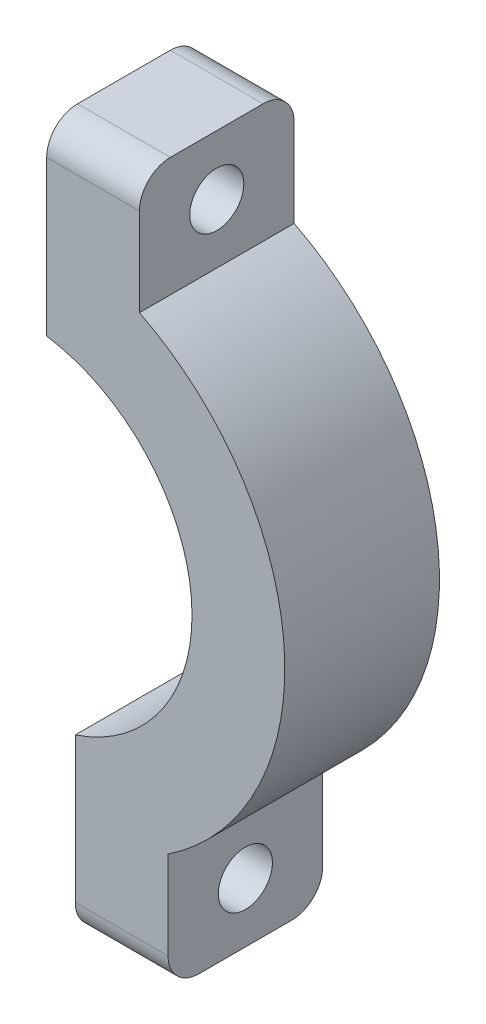
ISO-10303-21;
HEADER;
FILE_DESCRIPTION(('STEP AP214'),'2;1');
FILE_NAME('part.step','',(''),(''),'','','');
FILE_SCHEMA(('AUTOMOTIVE_DESIGN { 1 0 10303 214 1 1 1 1 }'));
ENDSEC;
DATA;
#1=APPLICATION_CONTEXT('core data for automotive mechanical design processes');
#2=APPLICATION_PROTOCOL_DEFINITION('international standard','automotive_design',2000,#1);
#3=PRODUCT_CONTEXT('',#1,'mechanical');
#4=PRODUCT('Part','Part','',(#3));
#5=PRODUCT_RELATED_PRODUCT_CATEGORY('part','',(#4));
#6=PRODUCT_DEFINITION_FORMATION('','',#4);
#7=PRODUCT_DEFINITION_CONTEXT('part definition',#1,'design');
#8=PRODUCT_DEFINITION('design','',#6,#7);
#9=PRODUCT_DEFINITION_SHAPE('','',#8);
#10=(LENGTH_UNIT() NAMED_UNIT(*) SI_UNIT(.MILLI.,.METRE.));
#11=(NAMED_UNIT(*) PLANE_ANGLE_UNIT() SI_UNIT($,.RADIAN.));
#12=(NAMED_UNIT(*) SI_UNIT($,.STERADIAN.) SOLID_ANGLE_UNIT());
#13=UNCERTAINTY_MEASURE_WITH_UNIT(LENGTH_MEASURE(1.E-05),#10,'distance_accuracy_value','');
#14=(GEOMETRIC_REPRESENTATION_CONTEXT(3) GLOBAL_UNCERTAINTY_ASSIGNED_CONTEXT((#13)) GLOBAL_UNIT_ASSIGNED_CONTEXT((#10,
#11,#12)) REPRESENTATION_CONTEXT('',''));
#15=CARTESIAN_POINT('',(0.,0.,0.));
#16=DIRECTION('',(0.,0.,1.));
#17=DIRECTION('',(1.,0.,0.));
#18=AXIS2_PLACEMENT_3D('',#15,#16,#17);
#19=CARTESIAN_POINT('',(9.5,-21.8581248758443,10.));
#20=DIRECTION('',(0.,-1.,0.));
#21=DIRECTION('',(0.,0.,-1.));
#22=AXIS2_PLACEMENT_3D('',#19,#20,#21);
#23=PLANE('',#22);
#24=DIRECTION('',(0.,0.,-1.));
#25=VECTOR('',#24,1.);
#26=CARTESIAN_POINT('',(9.5,-21.8581248758443,10.));
#27=LINE('',#26,#25);
#28=CARTESIAN_POINT('',(9.5,-21.8581248758443,8.));
#29=VERTEX_POINT('',#28);
#30=CARTESIAN_POINT('',(9.5,-21.8581248758443,2.));
#31=VERTEX_POINT('',#30);
#32=EDGE_CURVE('E132',#29,#31,#27,.T.);
#33=ORIENTED_EDGE('',*,*,#32,.F.);
#34=DIRECTION('',(-1.,0.,0.));
#35=VECTOR('',#34,1.);
#36=CARTESIAN_POINT('',(9.5,-21.8581248758443,8.));
#37=LINE('',#36,#35);
#38=CARTESIAN_POINT('',(3.5,-21.8581248758443,8.));
#39=VERTEX_POINT('',#38);
#40=EDGE_CURVE('E198',#29,#39,#37,.T.);
#41=ORIENTED_EDGE('',*,*,#40,.T.);
#42=DIRECTION('',(0.,0.,-1.));
#43=VECTOR('',#42,1.);
#44=CARTESIAN_POINT('',(3.5,-21.8581248758443,10.));
#45=LINE('',#44,#43);
#46=CARTESIAN_POINT('',(3.5,-21.8581248758443,2.));
#47=VERTEX_POINT('',#46);
#48=EDGE_CURVE('E186',#39,#47,#45,.T.);
#49=ORIENTED_EDGE('',*,*,#48,.T.);
#50=DIRECTION('',(-1.,0.,0.));
#51=VECTOR('',#50,1.);
#52=CARTESIAN_POINT('',(9.5,-21.8581248758443,2.));
#53=LINE('',#52,#51);
#54=EDGE_CURVE('E189',#47,#31,#53,.F.);
#55=ORIENTED_EDGE('',*,*,#54,.T.);
#56=EDGE_LOOP('',(#33,#41,#49,#55));
#57=FACE_BOUND('',#56,.T.);
#58=ADVANCED_FACE('F33',(#57),#23,.T.);
#59=CARTESIAN_POINT('',(9.5,-14.1581248758443,10.));
#60=DIRECTION('',(1.,0.,0.));
#61=DIRECTION('',(0.,1.,0.));
#62=AXIS2_PLACEMENT_3D('',#59,#60,#61);
#63=PLANE('',#62);
#64=CARTESIAN_POINT('',(9.5,-18.0081248758443,5.));
#65=DIRECTION('',(1.,0.,0.));
#66=DIRECTION('',(0.,1.,0.));
#67=AXIS2_PLACEMENT_3D('',#64,#65,#66);
#68=CIRCLE('',#67,1.75);
#69=CARTESIAN_POINT('',(9.5,-16.2581248758443,5.));
#70=VERTEX_POINT('',#69);
#71=EDGE_CURVE('E192',#70,#70,#68,.T.);
#72=ORIENTED_EDGE('',*,*,#71,.F.);
#73=EDGE_LOOP('',(#72));
#74=FACE_BOUND('',#73,.T.);
#75=DIRECTION('',(0.,-1.,0.));
#76=VECTOR('',#75,1.);
#77=CARTESIAN_POINT('',(9.5,-14.1581248758443,10.));
#78=LINE('',#77,#76);
#79=CARTESIAN_POINT('',(9.5,-14.1581248758443,10.));
#80=VERTEX_POINT('',#79);
#81=CARTESIAN_POINT('',(9.5,-19.8581248758443,10.));
#82=VERTEX_POINT('',#81);
#83=EDGE_CURVE('E126',#80,#82,#78,.T.);
#84=ORIENTED_EDGE('',*,*,#83,.T.);
#85=CARTESIAN_POINT('',(9.5,-19.8581248758443,8.));
#86=DIRECTION('',(1.,0.,0.));
#87=DIRECTION('',(0.,1.,0.));
#88=AXIS2_PLACEMENT_3D('',#85,#86,#87);
#89=CIRCLE('',#88,2.);
#90=EDGE_CURVE('E211',#82,#29,#89,.T.);
#91=ORIENTED_EDGE('',*,*,#90,.T.);
#92=ORIENTED_EDGE('',*,*,#32,.T.);
#93=CARTESIAN_POINT('',(9.5,-19.8581248758443,2.));
#94=DIRECTION('',(1.,0.,0.));
#95=DIRECTION('',(0.,1.,0.));
#96=AXIS2_PLACEMENT_3D('',#93,#94,#95);
#97=CIRCLE('',#96,2.);
#98=CARTESIAN_POINT('',(9.5,-19.8581248758443,0.));
#99=VERTEX_POINT('',#98);
#100=EDGE_CURVE('E209',#31,#99,#97,.T.);
#101=ORIENTED_EDGE('',*,*,#100,.T.);
#102=DIRECTION('',(0.,-1.,0.));
#103=VECTOR('',#102,1.);
#104=CARTESIAN_POINT('',(9.5,-14.1581248758443,0.));
#105=LINE('',#104,#103);
#106=CARTESIAN_POINT('',(9.5,-14.1581248758443,0.));
#107=VERTEX_POINT('',#106);
#108=EDGE_CURVE('E129',#107,#99,#105,.T.);
#109=ORIENTED_EDGE('',*,*,#108,.F.);
#110=DIRECTION('',(0.,0.,-1.));
#111=VECTOR('',#110,1.);
#112=CARTESIAN_POINT('',(9.5,-14.1581248758443,10.));
#113=LINE('',#112,#111);
#114=EDGE_CURVE('E122',#80,#107,#113,.T.);
#115=ORIENTED_EDGE('',*,*,#114,.F.);
#116=EDGE_LOOP('',(#84,#91,#92,#101,#109,#115));
#117=FACE_BOUND('',#116,.T.);
#118=ADVANCED_FACE('F124',(#74,#117),#63,.T.);
#119=CARTESIAN_POINT('',(0.,0.,10.));
#120=DIRECTION('',(0.,0.,-1.));
#121=DIRECTION('',(-1.,0.,0.));
#122=AXIS2_PLACEMENT_3D('',#119,#120,#121);
#123=CYLINDRICAL_SURFACE('',#122,17.05);
#124=CARTESIAN_POINT('',(0.,0.,0.));
#125=DIRECTION('',(0.,0.,1.));
#126=DIRECTION('',(1.,0.,0.));
#127=AXIS2_PLACEMENT_3D('',#124,#125,#126);
#128=CIRCLE('',#127,17.05);
#129=CARTESIAN_POINT('',(7.65,15.2374538555495,0.));
#130=VERTEX_POINT('',#129);
#131=EDGE_CURVE('E162',#107,#130,#128,.T.);
#132=ORIENTED_EDGE('',*,*,#131,.T.);
#133=DIRECTION('',(0.,0.,-1.));
#134=VECTOR('',#133,1.);
#135=CARTESIAN_POINT('',(7.65,15.2374538555495,10.));
#136=LINE('',#135,#134);
#137=CARTESIAN_POINT('',(7.65,15.2374538555495,10.));
#138=VERTEX_POINT('',#137);
#139=EDGE_CURVE('E133',#138,#130,#136,.T.);
#140=ORIENTED_EDGE('',*,*,#139,.F.);
#141=CARTESIAN_POINT('',(0.,0.,10.));
#142=DIRECTION('',(0.,0.,1.));
#143=DIRECTION('',(1.,0.,0.));
#144=AXIS2_PLACEMENT_3D('',#141,#142,#143);
#145=CIRCLE('',#144,17.05);
#146=EDGE_CURVE('E136',#80,#138,#145,.T.);
#147=ORIENTED_EDGE('',*,*,#146,.F.);
#148=ORIENTED_EDGE('',*,*,#114,.T.);
#149=EDGE_LOOP('',(#132,#140,#147,#148));
#150=FACE_BOUND('',#149,.T.);
#151=ADVANCED_FACE('F137',(#150),#123,.T.);
#152=CARTESIAN_POINT('',(7.65,15.2374538555495,10.));
#153=DIRECTION('',(-1.,0.,0.));
#154=DIRECTION('',(0.,0.,1.));
#155=AXIS2_PLACEMENT_3D('',#152,#153,#154);
#156=PLANE('',#155);
#157=CARTESIAN_POINT('',(7.65,19.0874538555495,5.));
#158=DIRECTION('',(1.,0.,0.));
#159=DIRECTION('',(0.,0.,-1.));
#160=AXIS2_PLACEMENT_3D('',#157,#158,#159);
#161=CIRCLE('',#160,1.75);
#162=CARTESIAN_POINT('',(7.65,19.0874538555495,3.25));
#163=VERTEX_POINT('',#162);
#164=EDGE_CURVE('E196',#163,#163,#161,.T.);
#165=ORIENTED_EDGE('',*,*,#164,.F.);
#166=EDGE_LOOP('',(#165));
#167=FACE_BOUND('',#166,.T.);
#168=DIRECTION('',(0.,1.,0.));
#169=VECTOR('',#168,1.);
#170=CARTESIAN_POINT('',(7.65,15.2374538555495,0.));
#171=LINE('',#170,#169);
#172=CARTESIAN_POINT('',(7.65,20.9374538555495,0.));
#173=VERTEX_POINT('',#172);
#174=EDGE_CURVE('E165',#130,#173,#171,.T.);
#175=ORIENTED_EDGE('',*,*,#174,.T.);
#176=CARTESIAN_POINT('',(7.65,20.9374538555495,2.));
#177=DIRECTION('',(-1.,0.,0.));
#178=DIRECTION('',(0.,0.,1.));
#179=AXIS2_PLACEMENT_3D('',#176,#177,#178);
#180=CIRCLE('',#179,2.);
#181=CARTESIAN_POINT('',(7.65,22.9374538555495,2.));
#182=VERTEX_POINT('',#181);
#183=EDGE_CURVE('E11',#173,#182,#180,.F.);
#184=ORIENTED_EDGE('',*,*,#183,.T.);
#185=DIRECTION('',(0.,0.,-1.));
#186=VECTOR('',#185,1.);
#187=CARTESIAN_POINT('',(7.65,22.9374538555495,10.));
#188=LINE('',#187,#186);
#189=CARTESIAN_POINT('',(7.65,22.9374538555495,8.));
#190=VERTEX_POINT('',#189);
#191=EDGE_CURVE('E181',#190,#182,#188,.T.);
#192=ORIENTED_EDGE('',*,*,#191,.F.);
#193=CARTESIAN_POINT('',(7.65,20.9374538555495,8.));
#194=DIRECTION('',(-1.,0.,0.));
#195=DIRECTION('',(0.,0.,1.));
#196=AXIS2_PLACEMENT_3D('',#193,#194,#195);
#197=CIRCLE('',#196,2.);
#198=CARTESIAN_POINT('',(7.65,20.9374538555495,10.));
#199=VERTEX_POINT('',#198);
#200=EDGE_CURVE('E41',#190,#199,#197,.F.);
#201=ORIENTED_EDGE('',*,*,#200,.T.);
#202=DIRECTION('',(0.,1.,0.));
#203=VECTOR('',#202,1.);
#204=CARTESIAN_POINT('',(7.65,15.2374538555495,10.));
#205=LINE('',#204,#203);
#206=EDGE_CURVE('E142',#138,#199,#205,.T.);
#207=ORIENTED_EDGE('',*,*,#206,.F.);
#208=ORIENTED_EDGE('',*,*,#139,.T.);
#209=EDGE_LOOP('',(#175,#184,#192,#201,#207,#208));
#210=FACE_BOUND('',#209,.T.);
#211=ADVANCED_FACE('F226',(#167,#210),#156,.F.);
#212=CARTESIAN_POINT('',(7.65,22.9374538555495,10.));
#213=DIRECTION('',(0.,-1.,0.));
#214=DIRECTION('',(0.,0.,-1.));
#215=AXIS2_PLACEMENT_3D('',#212,#213,#214);
#216=PLANE('',#215);
#217=ORIENTED_EDGE('',*,*,#191,.T.);
#218=DIRECTION('',(-1.,0.,0.));
#219=VECTOR('',#218,1.);
#220=CARTESIAN_POINT('',(7.65,22.9374538555495,2.));
#221=LINE('',#220,#219);
#222=CARTESIAN_POINT('',(1.65,22.9374538555495,2.));
#223=VERTEX_POINT('',#222);
#224=EDGE_CURVE('E219',#182,#223,#221,.T.);
#225=ORIENTED_EDGE('',*,*,#224,.T.);
#226=DIRECTION('',(0.,0.,-1.));
#227=VECTOR('',#226,1.);
#228=CARTESIAN_POINT('',(1.65,22.9374538555495,10.));
#229=LINE('',#228,#227);
#230=CARTESIAN_POINT('',(1.65,22.9374538555495,8.));
#231=VERTEX_POINT('',#230);
#232=EDGE_CURVE('E178',#231,#223,#229,.T.);
#233=ORIENTED_EDGE('',*,*,#232,.F.);
#234=DIRECTION('',(-1.,0.,0.));
#235=VECTOR('',#234,1.);
#236=CARTESIAN_POINT('',(7.65,22.9374538555495,8.));
#237=LINE('',#236,#235);
#238=EDGE_CURVE('E53',#231,#190,#237,.F.);
#239=ORIENTED_EDGE('',*,*,#238,.T.);
#240=EDGE_LOOP('',(#217,#225,#233,#239));
#241=FACE_BOUND('',#240,.T.);
#242=ADVANCED_FACE('F233',(#241),#216,.F.);
#243=CARTESIAN_POINT('',(1.65,20.4374538555495,10.));
#244=DIRECTION('',(1.,0.,0.));
#245=DIRECTION('',(0.,0.,-1.));
#246=AXIS2_PLACEMENT_3D('',#243,#244,#245);
#247=PLANE('',#246);
#248=CARTESIAN_POINT('',(1.65,19.0874538555495,5.));
#249=DIRECTION('',(1.,0.,0.));
#250=DIRECTION('',(0.,0.,-1.));
#251=AXIS2_PLACEMENT_3D('',#248,#249,#250);
#252=CIRCLE('',#251,1.75);
#253=CARTESIAN_POINT('',(1.65,19.0874538555495,3.25));
#254=VERTEX_POINT('',#253);
#255=EDGE_CURVE('E193',#254,#254,#252,.T.);
#256=ORIENTED_EDGE('',*,*,#255,.T.);
#257=EDGE_LOOP('',(#256));
#258=FACE_BOUND('',#257,.T.);
#259=ORIENTED_EDGE('',*,*,#232,.T.);
#260=CARTESIAN_POINT('',(1.65,20.9374538555495,2.));
#261=DIRECTION('',(1.,0.,0.));
#262=DIRECTION('',(0.,0.,-1.));
#263=AXIS2_PLACEMENT_3D('',#260,#261,#262);
#264=CIRCLE('',#263,2.);
#265=CARTESIAN_POINT('',(1.65,20.9374538555495,0.));
#266=VERTEX_POINT('',#265);
#267=EDGE_CURVE('E224',#223,#266,#264,.F.);
#268=ORIENTED_EDGE('',*,*,#267,.T.);
#269=DIRECTION('',(0.,-1.,0.));
#270=VECTOR('',#269,1.);
#271=CARTESIAN_POINT('',(1.65,20.4374538555495,0.));
#272=LINE('',#271,#270);
#273=CARTESIAN_POINT('',(1.65,10.9261155036911,0.));
#274=VERTEX_POINT('',#273);
#275=EDGE_CURVE('E167',#266,#274,#272,.T.);
#276=ORIENTED_EDGE('',*,*,#275,.T.);
#277=DIRECTION('',(0.,0.,-1.));
#278=VECTOR('',#277,1.);
#279=CARTESIAN_POINT('',(1.65,10.9261155036911,10.));
#280=LINE('',#279,#278);
#281=CARTESIAN_POINT('',(1.65,10.9261155036911,10.));
#282=VERTEX_POINT('',#281);
#283=EDGE_CURVE('E175',#282,#274,#280,.T.);
#284=ORIENTED_EDGE('',*,*,#283,.F.);
#285=DIRECTION('',(0.,-1.,0.));
#286=VECTOR('',#285,1.);
#287=CARTESIAN_POINT('',(1.65,22.9374538555495,10.));
#288=LINE('',#287,#286);
#289=CARTESIAN_POINT('',(1.65,20.9374538555495,10.));
#290=VERTEX_POINT('',#289);
#291=EDGE_CURVE('E155',#290,#282,#288,.T.);
#292=ORIENTED_EDGE('',*,*,#291,.F.);
#293=CARTESIAN_POINT('',(1.65,20.9374538555495,8.));
#294=DIRECTION('',(1.,0.,0.));
#295=DIRECTION('',(0.,0.,-1.));
#296=AXIS2_PLACEMENT_3D('',#293,#294,#295);
#297=CIRCLE('',#296,2.);
#298=EDGE_CURVE('E222',#290,#231,#297,.F.);
#299=ORIENTED_EDGE('',*,*,#298,.T.);
#300=EDGE_LOOP('',(#259,#268,#276,#284,#292,#299));
#301=FACE_BOUND('',#300,.T.);
#302=ADVANCED_FACE('F231',(#258,#301),#247,.F.);
#303=CARTESIAN_POINT('',(0.,0.,10.));
#304=DIRECTION('',(0.,0.,-1.));
#305=DIRECTION('',(-1.,0.,0.));
#306=AXIS2_PLACEMENT_3D('',#303,#304,#305);
#307=CYLINDRICAL_SURFACE('',#306,11.05);
#308=CARTESIAN_POINT('',(0.,0.,0.));
#309=DIRECTION('',(0.,0.,1.));
#310=DIRECTION('',(1.,0.,0.));
#311=AXIS2_PLACEMENT_3D('',#308,#309,#310);
#312=CIRCLE('',#311,11.05);
#313=CARTESIAN_POINT('',(3.5,-10.4810543362774,0.));
#314=VERTEX_POINT('',#313);
#315=EDGE_CURVE('E169',#314,#274,#312,.T.);
#316=ORIENTED_EDGE('',*,*,#315,.F.);
#317=DIRECTION('',(0.,0.,-1.));
#318=VECTOR('',#317,1.);
#319=CARTESIAN_POINT('',(3.5,-10.4810543362774,10.));
#320=LINE('',#319,#318);
#321=CARTESIAN_POINT('',(3.5,-10.4810543362774,10.));
#322=VERTEX_POINT('',#321);
#323=EDGE_CURVE('E160',#322,#314,#320,.T.);
#324=ORIENTED_EDGE('',*,*,#323,.F.);
#325=CARTESIAN_POINT('',(0.,0.,10.));
#326=DIRECTION('',(0.,0.,1.));
#327=DIRECTION('',(1.,0.,0.));
#328=AXIS2_PLACEMENT_3D('',#325,#326,#327);
#329=CIRCLE('',#328,11.05);
#330=EDGE_CURVE('E157',#322,#282,#329,.T.);
#331=ORIENTED_EDGE('',*,*,#330,.T.);
#332=ORIENTED_EDGE('',*,*,#283,.T.);
#333=EDGE_LOOP('',(#316,#324,#331,#332));
#334=FACE_BOUND('',#333,.T.);
#335=ADVANCED_FACE('F246',(#334),#307,.F.);
#336=CARTESIAN_POINT('',(3.5,-17.05,10.));
#337=DIRECTION('',(-1.,0.,0.));
#338=DIRECTION('',(0.,0.,1.));
#339=AXIS2_PLACEMENT_3D('',#336,#337,#338);
#340=PLANE('',#339);
#341=CARTESIAN_POINT('',(3.5,-18.0081248758443,5.));
#342=DIRECTION('',(-1.,0.,0.));
#343=DIRECTION('',(0.,0.,1.));
#344=AXIS2_PLACEMENT_3D('',#341,#342,#343);
#345=CIRCLE('',#344,1.75);
#346=CARTESIAN_POINT('',(3.5,-18.0081248758443,6.75));
#347=VERTEX_POINT('',#346);
#348=EDGE_CURVE('E163',#347,#347,#345,.T.);
#349=ORIENTED_EDGE('',*,*,#348,.F.);
#350=EDGE_LOOP('',(#349));
#351=FACE_BOUND('',#350,.T.);
#352=ORIENTED_EDGE('',*,*,#48,.F.);
#353=CARTESIAN_POINT('',(3.5,-19.8581248758443,8.));
#354=DIRECTION('',(-1.,0.,0.));
#355=DIRECTION('',(0.,0.,1.));
#356=AXIS2_PLACEMENT_3D('',#353,#354,#355);
#357=CIRCLE('',#356,2.);
#358=CARTESIAN_POINT('',(3.5,-19.8581248758443,10.));
#359=VERTEX_POINT('',#358);
#360=EDGE_CURVE('E203',#39,#359,#357,.T.);
#361=ORIENTED_EDGE('',*,*,#360,.T.);
#362=DIRECTION('',(0.,-1.,0.));
#363=VECTOR('',#362,1.);
#364=CARTESIAN_POINT('',(3.5,-17.05,10.));
#365=LINE('',#364,#363);
#366=EDGE_CURVE('E148',#322,#359,#365,.T.);
#367=ORIENTED_EDGE('',*,*,#366,.F.);
#368=ORIENTED_EDGE('',*,*,#323,.T.);
#369=DIRECTION('',(0.,1.,0.));
#370=VECTOR('',#369,1.);
#371=CARTESIAN_POINT('',(3.5,-17.05,0.));
#372=LINE('',#371,#370);
#373=CARTESIAN_POINT('',(3.5,-19.8581248758443,0.));
#374=VERTEX_POINT('',#373);
#375=EDGE_CURVE('E150',#374,#314,#372,.T.);
#376=ORIENTED_EDGE('',*,*,#375,.F.);
#377=CARTESIAN_POINT('',(3.5,-19.8581248758443,2.));
#378=DIRECTION('',(-1.,0.,0.));
#379=DIRECTION('',(0.,0.,1.));
#380=AXIS2_PLACEMENT_3D('',#377,#378,#379);
#381=CIRCLE('',#380,2.);
#382=EDGE_CURVE('E201',#374,#47,#381,.T.);
#383=ORIENTED_EDGE('',*,*,#382,.T.);
#384=EDGE_LOOP('',(#352,#361,#367,#368,#376,#383));
#385=FACE_BOUND('',#384,.T.);
#386=ADVANCED_FACE('F260',(#351,#385),#340,.T.);
#387=CARTESIAN_POINT('',(0.,0.,10.));
#388=DIRECTION('',(0.,0.,1.));
#389=DIRECTION('',(1.,0.,0.));
#390=AXIS2_PLACEMENT_3D('',#387,#388,#389);
#391=PLANE('',#390);
#392=ORIENTED_EDGE('',*,*,#366,.T.);
#393=DIRECTION('',(-1.,0.,0.));
#394=VECTOR('',#393,1.);
#395=CARTESIAN_POINT('',(0.,-19.8581248758443,10.));
#396=LINE('',#395,#394);
#397=EDGE_CURVE('E147',#359,#82,#396,.F.);
#398=ORIENTED_EDGE('',*,*,#397,.T.);
#399=ORIENTED_EDGE('',*,*,#83,.F.);
#400=ORIENTED_EDGE('',*,*,#146,.T.);
#401=ORIENTED_EDGE('',*,*,#206,.T.);
#402=DIRECTION('',(-1.,0.,0.));
#403=VECTOR('',#402,1.);
#404=CARTESIAN_POINT('',(1.65,20.9374538555495,10.));
#405=LINE('',#404,#403);
#406=EDGE_CURVE('E205',#199,#290,#405,.T.);
#407=ORIENTED_EDGE('',*,*,#406,.T.);
#408=ORIENTED_EDGE('',*,*,#291,.T.);
#409=ORIENTED_EDGE('',*,*,#330,.F.);
#410=EDGE_LOOP('',(#392,#398,#399,#400,#401,#407,#408,#409));
#411=FACE_BOUND('',#410,.T.);
#412=ADVANCED_FACE('F145',(#411),#391,.T.);
#413=CARTESIAN_POINT('',(0.,0.,0.));
#414=DIRECTION('',(0.,0.,1.));
#415=DIRECTION('',(1.,0.,0.));
#416=AXIS2_PLACEMENT_3D('',#413,#414,#415);
#417=PLANE('',#416);
#418=ORIENTED_EDGE('',*,*,#108,.T.);
#419=DIRECTION('',(-1.,0.,0.));
#420=VECTOR('',#419,1.);
#421=CARTESIAN_POINT('',(3.5,-19.8581248758443,0.));
#422=LINE('',#421,#420);
#423=EDGE_CURVE('E215',#99,#374,#422,.T.);
#424=ORIENTED_EDGE('',*,*,#423,.T.);
#425=ORIENTED_EDGE('',*,*,#375,.T.);
#426=ORIENTED_EDGE('',*,*,#315,.T.);
#427=ORIENTED_EDGE('',*,*,#275,.F.);
#428=DIRECTION('',(-1.,0.,0.));
#429=VECTOR('',#428,1.);
#430=CARTESIAN_POINT('',(0.,20.9374538555495,0.));
#431=LINE('',#430,#429);
#432=EDGE_CURVE('E213',#266,#173,#431,.F.);
#433=ORIENTED_EDGE('',*,*,#432,.T.);
#434=ORIENTED_EDGE('',*,*,#174,.F.);
#435=ORIENTED_EDGE('',*,*,#131,.F.);
#436=EDGE_LOOP('',(#418,#424,#425,#426,#427,#433,#434,#435));
#437=FACE_BOUND('',#436,.T.);
#438=ADVANCED_FACE('F240',(#437),#417,.F.);
#439=CARTESIAN_POINT('',(-0.500000000000002,-18.0081248758443,5.));
#440=DIRECTION('',(1.,0.,0.));
#441=DIRECTION('',(0.,1.,0.));
#442=AXIS2_PLACEMENT_3D('',#439,#440,#441);
#443=CYLINDRICAL_SURFACE('',#442,1.75);
#444=ORIENTED_EDGE('',*,*,#348,.T.);
#445=EDGE_LOOP('',(#444));
#446=FACE_BOUND('',#445,.T.);
#447=ORIENTED_EDGE('',*,*,#71,.T.);
#448=EDGE_LOOP('',(#447));
#449=FACE_BOUND('',#448,.T.);
#450=ADVANCED_FACE('F318',(#446,#449),#443,.F.);
#451=CARTESIAN_POINT('',(-2.35,19.0874538555495,5.));
#452=DIRECTION('',(1.,0.,0.));
#453=DIRECTION('',(0.,0.,-1.));
#454=AXIS2_PLACEMENT_3D('',#451,#452,#453);
#455=CYLINDRICAL_SURFACE('',#454,1.75);
#456=ORIENTED_EDGE('',*,*,#164,.T.);
#457=EDGE_LOOP('',(#456));
#458=FACE_BOUND('',#457,.T.);
#459=ORIENTED_EDGE('',*,*,#255,.F.);
#460=EDGE_LOOP('',(#459));
#461=FACE_BOUND('',#460,.T.);
#462=ADVANCED_FACE('F283',(#458,#461),#455,.F.);
#463=CARTESIAN_POINT('',(9.5,-19.8581248758443,8.));
#464=DIRECTION('',(-1.,0.,0.));
#465=DIRECTION('',(0.,0.,1.));
#466=AXIS2_PLACEMENT_3D('',#463,#464,#465);
#467=CYLINDRICAL_SURFACE('',#466,2.);
#468=ORIENTED_EDGE('',*,*,#90,.F.);
#469=ORIENTED_EDGE('',*,*,#397,.F.);
#470=ORIENTED_EDGE('',*,*,#360,.F.);
#471=ORIENTED_EDGE('',*,*,#40,.F.);
#472=EDGE_LOOP('',(#468,#469,#470,#471));
#473=FACE_BOUND('',#472,.T.);
#474=ADVANCED_FACE('F250',(#473),#467,.T.);
#475=CARTESIAN_POINT('',(0.,-19.8581248758443,2.));
#476=DIRECTION('',(1.,0.,0.));
#477=DIRECTION('',(0.,0.,-1.));
#478=AXIS2_PLACEMENT_3D('',#475,#476,#477);
#479=CYLINDRICAL_SURFACE('',#478,2.);
#480=ORIENTED_EDGE('',*,*,#100,.F.);
#481=ORIENTED_EDGE('',*,*,#54,.F.);
#482=ORIENTED_EDGE('',*,*,#382,.F.);
#483=ORIENTED_EDGE('',*,*,#423,.F.);
#484=EDGE_LOOP('',(#480,#481,#482,#483));
#485=FACE_BOUND('',#484,.T.);
#486=ADVANCED_FACE('F258',(#485),#479,.T.);
#487=CARTESIAN_POINT('',(7.65,20.9374538555495,2.));
#488=DIRECTION('',(-1.,0.,0.));
#489=DIRECTION('',(0.,0.,1.));
#490=AXIS2_PLACEMENT_3D('',#487,#488,#489);
#491=CYLINDRICAL_SURFACE('',#490,2.);
#492=ORIENTED_EDGE('',*,*,#183,.F.);
#493=ORIENTED_EDGE('',*,*,#432,.F.);
#494=ORIENTED_EDGE('',*,*,#267,.F.);
#495=ORIENTED_EDGE('',*,*,#224,.F.);
#496=EDGE_LOOP('',(#492,#493,#494,#495));
#497=FACE_BOUND('',#496,.T.);
#498=ADVANCED_FACE('F236',(#497),#491,.T.);
#499=CARTESIAN_POINT('',(0.,20.9374538555495,8.));
#500=DIRECTION('',(1.,0.,0.));
#501=DIRECTION('',(0.,0.,-1.));
#502=AXIS2_PLACEMENT_3D('',#499,#500,#501);
#503=CYLINDRICAL_SURFACE('',#502,2.);
#504=ORIENTED_EDGE('',*,*,#200,.F.);
#505=ORIENTED_EDGE('',*,*,#238,.F.);
#506=ORIENTED_EDGE('',*,*,#298,.F.);
#507=ORIENTED_EDGE('',*,*,#406,.F.);
#508=EDGE_LOOP('',(#504,#505,#506,#507));
#509=FACE_BOUND('',#508,.T.);
#510=ADVANCED_FACE('F35',(#509),#503,.T.);
#511=CLOSED_SHELL('',(#58,#118,#151,#211,#242,#302,#335,#386,#412,#438,#450,#462,#474,#486,#498,#510));
#512=MANIFOLD_SOLID_BREP('B2',#511);
#513=ADVANCED_BREP_SHAPE_REPRESENTATION('',(#18,#512),#14);
#514=SHAPE_DEFINITION_REPRESENTATION(#9,#513);
ENDSEC;
END-ISO-10303-21;
